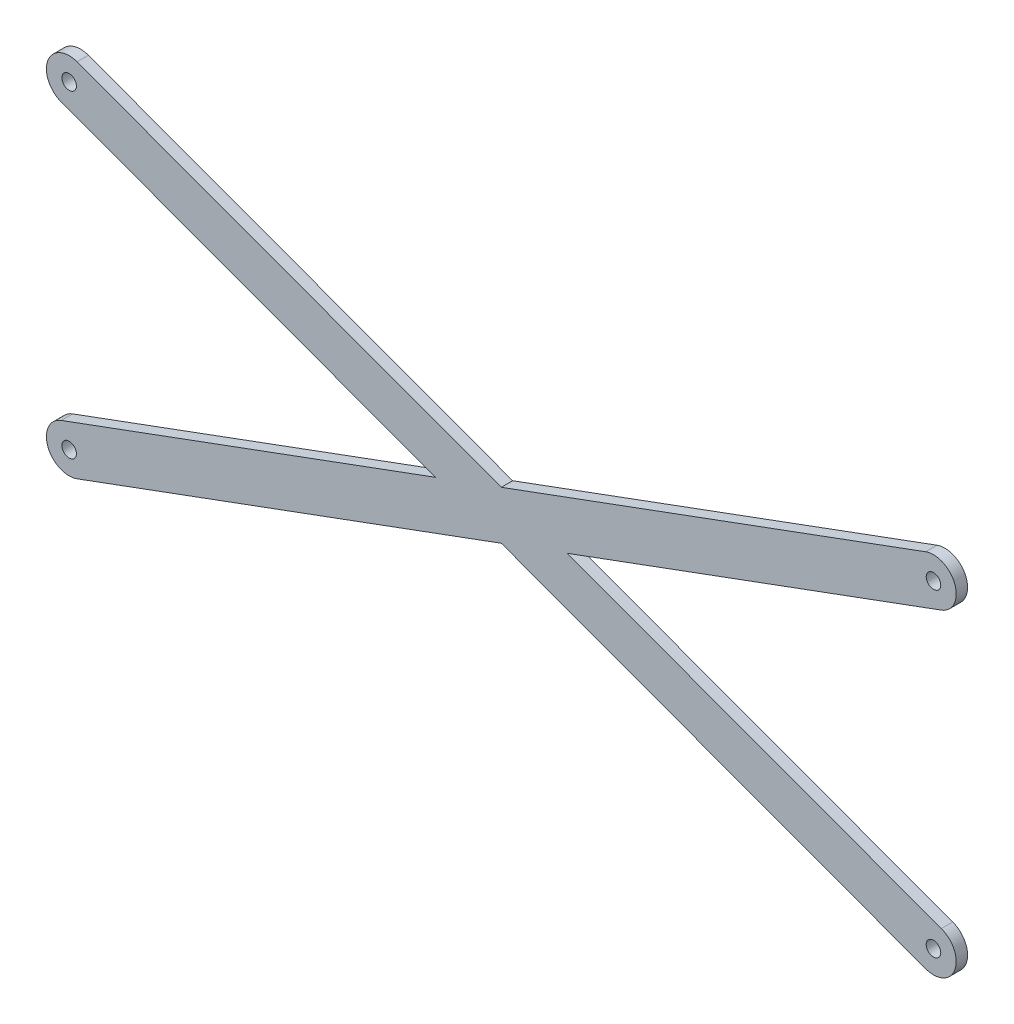
ISO-10303-21;
HEADER;
FILE_DESCRIPTION(('STEP AP214'),'2;1');
FILE_NAME('part.step','',(''),(''),'','','');
FILE_SCHEMA(('AUTOMOTIVE_DESIGN { 1 0 10303 214 1 1 1 1 }'));
ENDSEC;
DATA;
#1=APPLICATION_CONTEXT('core data for automotive mechanical design processes');
#2=APPLICATION_PROTOCOL_DEFINITION('international standard','automotive_design',2000,#1);
#3=PRODUCT_CONTEXT('',#1,'mechanical');
#4=PRODUCT('Part','Part','',(#3));
#5=PRODUCT_RELATED_PRODUCT_CATEGORY('part','',(#4));
#6=PRODUCT_DEFINITION_FORMATION('','',#4);
#7=PRODUCT_DEFINITION_CONTEXT('part definition',#1,'design');
#8=PRODUCT_DEFINITION('design','',#6,#7);
#9=PRODUCT_DEFINITION_SHAPE('','',#8);
#10=(LENGTH_UNIT() NAMED_UNIT(*) SI_UNIT(.MILLI.,.METRE.));
#11=(NAMED_UNIT(*) PLANE_ANGLE_UNIT() SI_UNIT($,.RADIAN.));
#12=(NAMED_UNIT(*) SI_UNIT($,.STERADIAN.) SOLID_ANGLE_UNIT());
#13=UNCERTAINTY_MEASURE_WITH_UNIT(LENGTH_MEASURE(1.E-05),#10,'distance_accuracy_value','');
#14=(GEOMETRIC_REPRESENTATION_CONTEXT(3) GLOBAL_UNCERTAINTY_ASSIGNED_CONTEXT((#13)) GLOBAL_UNIT_ASSIGNED_CONTEXT((#10,
#11,#12)) REPRESENTATION_CONTEXT('',''));
#15=CARTESIAN_POINT('',(0.,0.,0.));
#16=DIRECTION('',(0.,0.,1.));
#17=DIRECTION('',(1.,0.,0.));
#18=AXIS2_PLACEMENT_3D('',#15,#16,#17);
#19=CARTESIAN_POINT('',(0.,-88.9,3.175));
#20=DIRECTION('',(0.,0.,-1.));
#21=DIRECTION('',(-1.,0.,0.));
#22=AXIS2_PLACEMENT_3D('',#19,#20,#21);
#23=CYLINDRICAL_SURFACE('',#22,6.35000000224302);
#24=CARTESIAN_POINT('',(0.,-88.9,0.));
#25=DIRECTION('',(0.,0.,1.));
#26=DIRECTION('',(1.,0.,0.));
#27=AXIS2_PLACEMENT_3D('',#24,#25,#26);
#28=CIRCLE('',#27,6.35000000224302);
#29=CARTESIAN_POINT('',(-2.19522676691837,-82.9415203701969,0.));
#30=VERTEX_POINT('',#29);
#31=CARTESIAN_POINT('',(2.19545073608075,-94.8583971053835,0.));
#32=VERTEX_POINT('',#31);
#33=EDGE_CURVE('E182',#30,#32,#28,.T.);
#34=ORIENTED_EDGE('',*,*,#33,.T.);
#35=DIRECTION('',(0.,0.,-1.));
#36=VECTOR('',#35,1.);
#37=CARTESIAN_POINT('',(2.19545073608075,-94.8583971053835,3.175));
#38=LINE('',#37,#36);
#39=CARTESIAN_POINT('',(2.19545073608075,-94.8583971053835,3.175));
#40=VERTEX_POINT('',#39);
#41=EDGE_CURVE('E11',#40,#32,#38,.T.);
#42=ORIENTED_EDGE('',*,*,#41,.F.);
#43=CARTESIAN_POINT('',(0.,-88.9,3.175));
#44=DIRECTION('',(0.,0.,1.));
#45=DIRECTION('',(1.,0.,0.));
#46=AXIS2_PLACEMENT_3D('',#43,#44,#45);
#47=CIRCLE('',#46,6.35000000224302);
#48=CARTESIAN_POINT('',(-2.19522676691837,-82.9415203701969,3.175));
#49=VERTEX_POINT('',#48);
#50=EDGE_CURVE('E217',#49,#40,#47,.T.);
#51=ORIENTED_EDGE('',*,*,#50,.F.);
#52=DIRECTION('',(0.,0.,-1.));
#53=VECTOR('',#52,1.);
#54=CARTESIAN_POINT('',(-2.19522676691837,-82.9415203701969,3.175));
#55=LINE('',#54,#53);
#56=EDGE_CURVE('E178',#49,#30,#55,.T.);
#57=ORIENTED_EDGE('',*,*,#56,.T.);
#58=EDGE_LOOP('',(#34,#42,#51,#57));
#59=FACE_BOUND('',#58,.T.);
#60=ADVANCED_FACE('F49',(#59),#23,.T.);
#61=CARTESIAN_POINT('',(2.19545073608075,-94.8583971053835,3.175));
#62=DIRECTION('',(-0.345705002420081,0.938343248124977,0.));
#63=DIRECTION('',(-0.938343248124977,-0.345705002420081,0.));
#64=AXIS2_PLACEMENT_3D('',#61,#62,#63);
#65=PLANE('',#64);
#66=DIRECTION('',(0.938343248124977,0.345705002420081,0.));
#67=VECTOR('',#66,1.);
#68=CARTESIAN_POINT('',(2.19545073608075,-94.8583971053835,0.));
#69=LINE('',#68,#67);
#70=CARTESIAN_POINT('',(120.65,-51.2172984756647,0.));
#71=VERTEX_POINT('',#70);
#72=EDGE_CURVE('E186',#32,#71,#69,.T.);
#73=ORIENTED_EDGE('',*,*,#72,.T.);
#74=DIRECTION('',(0.,0.,-1.));
#75=VECTOR('',#74,1.);
#76=CARTESIAN_POINT('',(120.65,-51.2172984756647,3.175));
#77=LINE('',#76,#75);
#78=CARTESIAN_POINT('',(120.65,-51.2172984756647,3.175));
#79=VERTEX_POINT('',#78);
#80=EDGE_CURVE('E58',#79,#71,#77,.T.);
#81=ORIENTED_EDGE('',*,*,#80,.F.);
#82=DIRECTION('',(0.938343248124977,0.345705002420081,0.));
#83=VECTOR('',#82,1.);
#84=CARTESIAN_POINT('',(2.19545073608075,-94.8583971053835,3.175));
#85=LINE('',#84,#83);
#86=EDGE_CURVE('E128',#40,#79,#85,.T.);
#87=ORIENTED_EDGE('',*,*,#86,.F.);
#88=ORIENTED_EDGE('',*,*,#41,.T.);
#89=EDGE_LOOP('',(#73,#81,#87,#88));
#90=FACE_BOUND('',#89,.T.);
#91=ADVANCED_FACE('F313',(#90),#65,.F.);
#92=CARTESIAN_POINT('',(120.65,-51.2172984756647,3.175));
#93=DIRECTION('',(0.34570570242205,0.93834299022952,0.));
#94=DIRECTION('',(-0.93834299022952,0.34570570242205,0.));
#95=AXIS2_PLACEMENT_3D('',#92,#93,#94);
#96=PLANE('',#95);
#97=DIRECTION('',(0.93834299022952,-0.34570570242205,0.));
#98=VECTOR('',#97,1.);
#99=CARTESIAN_POINT('',(120.65,-51.2172984756647,0.));
#100=LINE('',#99,#98);
#101=CARTESIAN_POINT('',(239.104516707713,-94.8584854722301,0.));
#102=VERTEX_POINT('',#101);
#103=EDGE_CURVE('E190',#71,#102,#100,.T.);
#104=ORIENTED_EDGE('',*,*,#103,.T.);
#105=DIRECTION('',(0.,0.,-1.));
#106=VECTOR('',#105,1.);
#107=CARTESIAN_POINT('',(239.104516707713,-94.8584854722301,3.175));
#108=LINE('',#107,#106);
#109=CARTESIAN_POINT('',(239.104516707713,-94.8584854722301,3.175));
#110=VERTEX_POINT('',#109);
#111=EDGE_CURVE('E244',#110,#102,#108,.T.);
#112=ORIENTED_EDGE('',*,*,#111,.F.);
#113=DIRECTION('',(0.93834299022952,-0.34570570242205,0.));
#114=VECTOR('',#113,1.);
#115=CARTESIAN_POINT('',(120.65,-51.2172984756647,3.175));
#116=LINE('',#115,#114);
#117=EDGE_CURVE('E254',#79,#110,#116,.T.);
#118=ORIENTED_EDGE('',*,*,#117,.F.);
#119=ORIENTED_EDGE('',*,*,#80,.T.);
#120=EDGE_LOOP('',(#104,#112,#118,#119));
#121=FACE_BOUND('',#120,.T.);
#122=ADVANCED_FACE('F252',(#121),#96,.F.);
#123=CARTESIAN_POINT('',(241.299727603608,-88.9,3.175));
#124=DIRECTION('',(0.,0.,-1.));
#125=DIRECTION('',(-1.,0.,0.));
#126=AXIS2_PLACEMENT_3D('',#123,#124,#125);
#127=CYLINDRICAL_SURFACE('',#126,6.35000000001843);
#128=CARTESIAN_POINT('',(241.299727603608,-88.9,0.));
#129=DIRECTION('',(0.,0.,1.));
#130=DIRECTION('',(1.,0.,0.));
#131=AXIS2_PLACEMENT_3D('',#128,#129,#130);
#132=CIRCLE('',#131,6.35000000001843);
#133=CARTESIAN_POINT('',(243.494958814001,-82.9415220120079,0.));
#134=VERTEX_POINT('',#133);
#135=EDGE_CURVE('E193',#102,#134,#132,.T.);
#136=ORIENTED_EDGE('',*,*,#135,.T.);
#137=DIRECTION('',(0.,0.,-1.));
#138=VECTOR('',#137,1.);
#139=CARTESIAN_POINT('',(243.494958814001,-82.9415220120079,3.175));
#140=LINE('',#139,#138);
#141=CARTESIAN_POINT('',(243.494958814001,-82.9415220120079,3.175));
#142=VERTEX_POINT('',#141);
#143=EDGE_CURVE('E240',#142,#134,#140,.T.);
#144=ORIENTED_EDGE('',*,*,#143,.F.);
#145=CARTESIAN_POINT('',(241.299727603608,-88.9,3.175));
#146=DIRECTION('',(0.,0.,1.));
#147=DIRECTION('',(1.,0.,0.));
#148=AXIS2_PLACEMENT_3D('',#145,#146,#147);
#149=CIRCLE('',#148,6.35000000001843);
#150=EDGE_CURVE('E273',#110,#142,#149,.T.);
#151=ORIENTED_EDGE('',*,*,#150,.F.);
#152=ORIENTED_EDGE('',*,*,#111,.T.);
#153=EDGE_LOOP('',(#136,#144,#151,#152));
#154=FACE_BOUND('',#153,.T.);
#155=ADVANCED_FACE('F263',(#154),#127,.T.);
#156=CARTESIAN_POINT('',(139.018245756537,-44.4500579627661,3.175));
#157=DIRECTION('',(-0.34570570242205,-0.93834299022952,0.));
#158=DIRECTION('',(0.93834299022952,-0.34570570242205,0.));
#159=AXIS2_PLACEMENT_3D('',#156,#157,#158);
#160=PLANE('',#159);
#161=DIRECTION('',(-0.93834299022952,0.34570570242205,0.));
#162=VECTOR('',#161,1.);
#163=CARTESIAN_POINT('',(139.018245756537,-44.4500579627661,0.));
#164=LINE('',#163,#162);
#165=CARTESIAN_POINT('',(139.018245756537,-44.4500579627661,0.));
#166=VERTEX_POINT('',#165);
#167=EDGE_CURVE('E196',#134,#166,#164,.T.);
#168=ORIENTED_EDGE('',*,*,#167,.T.);
#169=DIRECTION('',(0.,0.,-1.));
#170=VECTOR('',#169,1.);
#171=CARTESIAN_POINT('',(139.018245756537,-44.4500579627661,3.175));
#172=LINE('',#171,#170);
#173=CARTESIAN_POINT('',(139.018245756537,-44.4500579627661,3.175));
#174=VERTEX_POINT('',#173);
#175=EDGE_CURVE('E236',#174,#166,#172,.T.);
#176=ORIENTED_EDGE('',*,*,#175,.F.);
#177=DIRECTION('',(-0.93834299022952,0.34570570242205,0.));
#178=VECTOR('',#177,1.);
#179=CARTESIAN_POINT('',(139.018245756537,-44.4500579627661,3.175));
#180=LINE('',#179,#178);
#181=EDGE_CURVE('E269',#142,#174,#180,.T.);
#182=ORIENTED_EDGE('',*,*,#181,.F.);
#183=ORIENTED_EDGE('',*,*,#143,.T.);
#184=EDGE_LOOP('',(#168,#176,#182,#183));
#185=FACE_BOUND('',#184,.T.);
#186=ADVANCED_FACE('F267',(#185),#160,.F.);
#187=CARTESIAN_POINT('',(139.018245756537,-44.4500579627661,3.175));
#188=DIRECTION('',(-0.345705002420081,0.938343248124977,0.));
#189=DIRECTION('',(-0.938343248124977,-0.345705002420081,0.));
#190=AXIS2_PLACEMENT_3D('',#187,#188,#189);
#191=PLANE('',#190);
#192=DIRECTION('',(0.938343248124977,0.345705002420081,0.));
#193=VECTOR('',#192,1.);
#194=CARTESIAN_POINT('',(139.018245756537,-44.4500579627661,0.));
#195=LINE('',#194,#193);
#196=CARTESIAN_POINT('',(243.495226766108,-5.9585837105964,0.));
#197=VERTEX_POINT('',#196);
#198=EDGE_CURVE('E199',#166,#197,#195,.T.);
#199=ORIENTED_EDGE('',*,*,#198,.T.);
#200=DIRECTION('',(0.,0.,-1.));
#201=VECTOR('',#200,1.);
#202=CARTESIAN_POINT('',(243.495226766108,-5.9585837105964,3.175));
#203=LINE('',#202,#201);
#204=CARTESIAN_POINT('',(243.495226766108,-5.9585837105964,3.175));
#205=VERTEX_POINT('',#204);
#206=EDGE_CURVE('E232',#205,#197,#203,.T.);
#207=ORIENTED_EDGE('',*,*,#206,.F.);
#208=DIRECTION('',(0.938343248124977,0.345705002420081,0.));
#209=VECTOR('',#208,1.);
#210=CARTESIAN_POINT('',(139.018245756537,-44.4500579627661,3.175));
#211=LINE('',#210,#209);
#212=EDGE_CURVE('E272',#174,#205,#211,.T.);
#213=ORIENTED_EDGE('',*,*,#212,.F.);
#214=ORIENTED_EDGE('',*,*,#175,.T.);
#215=EDGE_LOOP('',(#199,#207,#213,#214));
#216=FACE_BOUND('',#215,.T.);
#217=ADVANCED_FACE('F326',(#216),#191,.F.);
#218=CARTESIAN_POINT('',(241.3,-0.000104082991909853,3.175));
#219=DIRECTION('',(0.,0.,-1.));
#220=DIRECTION('',(-1.,0.,0.));
#221=AXIS2_PLACEMENT_3D('',#218,#219,#220);
#222=CYLINDRICAL_SURFACE('',#221,6.35000000214303);
#223=CARTESIAN_POINT('',(241.3,-0.000104082991909853,0.));
#224=DIRECTION('',(0.,0.,1.));
#225=DIRECTION('',(1.,0.,0.));
#226=AXIS2_PLACEMENT_3D('',#223,#224,#225);
#227=CIRCLE('',#226,6.35000000214303);
#228=CARTESIAN_POINT('',(239.104554312271,5.95829488252167,0.));
#229=VERTEX_POINT('',#228);
#230=EDGE_CURVE('E202',#197,#229,#227,.T.);
#231=ORIENTED_EDGE('',*,*,#230,.T.);
#232=DIRECTION('',(0.,0.,-1.));
#233=VECTOR('',#232,1.);
#234=CARTESIAN_POINT('',(239.104554312271,5.95829488252167,3.175));
#235=LINE('',#234,#233);
#236=CARTESIAN_POINT('',(239.104554312271,5.95829488252167,3.175));
#237=VERTEX_POINT('',#236);
#238=EDGE_CURVE('E228',#237,#229,#235,.T.);
#239=ORIENTED_EDGE('',*,*,#238,.F.);
#240=CARTESIAN_POINT('',(241.3,-0.000104082991909853,3.175));
#241=DIRECTION('',(0.,0.,1.));
#242=DIRECTION('',(1.,0.,0.));
#243=AXIS2_PLACEMENT_3D('',#240,#241,#242);
#244=CIRCLE('',#243,6.35000000214303);
#245=EDGE_CURVE('E277',#205,#237,#244,.T.);
#246=ORIENTED_EDGE('',*,*,#245,.F.);
#247=ORIENTED_EDGE('',*,*,#206,.T.);
#248=EDGE_LOOP('',(#231,#239,#246,#247));
#249=FACE_BOUND('',#248,.T.);
#250=ADVANCED_FACE('F329',(#249),#222,.T.);
#251=CARTESIAN_POINT('',(120.650005048352,-37.6828037471971,3.175));
#252=DIRECTION('',(0.345705002420081,-0.938343248124977,0.));
#253=DIRECTION('',(0.938343248124977,0.345705002420081,0.));
#254=AXIS2_PLACEMENT_3D('',#251,#252,#253);
#255=PLANE('',#254);
#256=DIRECTION('',(-0.938343248124977,-0.345705002420081,0.));
#257=VECTOR('',#256,1.);
#258=CARTESIAN_POINT('',(120.650005048352,-37.6828037471971,0.));
#259=LINE('',#258,#257);
#260=CARTESIAN_POINT('',(120.650005048352,-37.6828037471971,0.));
#261=VERTEX_POINT('',#260);
#262=EDGE_CURVE('E205',#229,#261,#259,.T.);
#263=ORIENTED_EDGE('',*,*,#262,.T.);
#264=DIRECTION('',(0.,0.,-1.));
#265=VECTOR('',#264,1.);
#266=CARTESIAN_POINT('',(120.650005048352,-37.6828037471971,3.175));
#267=LINE('',#266,#265);
#268=CARTESIAN_POINT('',(120.650005048352,-37.6828037471971,3.175));
#269=VERTEX_POINT('',#268);
#270=EDGE_CURVE('E224',#269,#261,#267,.T.);
#271=ORIENTED_EDGE('',*,*,#270,.F.);
#272=DIRECTION('',(-0.938343248124977,-0.345705002420081,0.));
#273=VECTOR('',#272,1.);
#274=CARTESIAN_POINT('',(120.650005048352,-37.6828037471971,3.175));
#275=LINE('',#274,#273);
#276=EDGE_CURVE('E284',#237,#269,#275,.T.);
#277=ORIENTED_EDGE('',*,*,#276,.F.);
#278=ORIENTED_EDGE('',*,*,#238,.T.);
#279=EDGE_LOOP('',(#263,#271,#277,#278));
#280=FACE_BOUND('',#279,.T.);
#281=ADVANCED_FACE('F292',(#280),#255,.F.);
#282=CARTESIAN_POINT('',(2.1954883406325,5.95838324935099,3.175));
#283=DIRECTION('',(-0.34570570242205,-0.93834299022952,0.));
#284=DIRECTION('',(0.93834299022952,-0.34570570242205,0.));
#285=AXIS2_PLACEMENT_3D('',#282,#283,#284);
#286=PLANE('',#285);
#287=DIRECTION('',(-0.93834299022952,0.34570570242205,0.));
#288=VECTOR('',#287,1.);
#289=CARTESIAN_POINT('',(2.1954883406325,5.95838324935099,0.));
#290=LINE('',#289,#288);
#291=CARTESIAN_POINT('',(2.19548834165465,5.95838325212504,0.));
#292=VERTEX_POINT('',#291);
#293=EDGE_CURVE('E208',#261,#292,#290,.T.);
#294=ORIENTED_EDGE('',*,*,#293,.T.);
#295=DIRECTION('',(0.,0.,-1.));
#296=VECTOR('',#295,1.);
#297=CARTESIAN_POINT('',(2.19548834165465,5.95838325212504,3.175));
#298=LINE('',#297,#296);
#299=CARTESIAN_POINT('',(2.19548834165465,5.95838325212504,3.175));
#300=VERTEX_POINT('',#299);
#301=EDGE_CURVE('E171',#300,#292,#298,.T.);
#302=ORIENTED_EDGE('',*,*,#301,.F.);
#303=DIRECTION('',(-0.93834299022952,0.34570570242205,0.));
#304=VECTOR('',#303,1.);
#305=CARTESIAN_POINT('',(2.1954883406325,5.95838324935099,3.175));
#306=LINE('',#305,#304);
#307=EDGE_CURVE('E160',#269,#300,#306,.T.);
#308=ORIENTED_EDGE('',*,*,#307,.F.);
#309=ORIENTED_EDGE('',*,*,#270,.T.);
#310=EDGE_LOOP('',(#294,#302,#308,#309));
#311=FACE_BOUND('',#310,.T.);
#312=ADVANCED_FACE('F296',(#311),#286,.F.);
#313=CARTESIAN_POINT('',(0.,0.,3.175));
#314=DIRECTION('',(0.,0.,-1.));
#315=DIRECTION('',(-1.,0.,0.));
#316=AXIS2_PLACEMENT_3D('',#313,#314,#315);
#317=CYLINDRICAL_SURFACE('',#316,6.35000000295635);
#318=CARTESIAN_POINT('',(0.,0.,0.));
#319=DIRECTION('',(0.,0.,1.));
#320=DIRECTION('',(1.,0.,0.));
#321=AXIS2_PLACEMENT_3D('',#318,#319,#320);
#322=CIRCLE('',#321,6.35000000295635);
#323=CARTESIAN_POINT('',(-2.19523121242408,-5.95847799350562,0.));
#324=VERTEX_POINT('',#323);
#325=EDGE_CURVE('E169',#292,#324,#322,.T.);
#326=ORIENTED_EDGE('',*,*,#325,.T.);
#327=DIRECTION('',(0.,0.,-1.));
#328=VECTOR('',#327,1.);
#329=CARTESIAN_POINT('',(-2.19523121242408,-5.95847799350562,3.175));
#330=LINE('',#329,#328);
#331=CARTESIAN_POINT('',(-2.19523121242408,-5.95847799350562,3.175));
#332=VERTEX_POINT('',#331);
#333=EDGE_CURVE('E166',#332,#324,#330,.T.);
#334=ORIENTED_EDGE('',*,*,#333,.F.);
#335=CARTESIAN_POINT('',(0.,0.,3.175));
#336=DIRECTION('',(0.,0.,1.));
#337=DIRECTION('',(1.,0.,0.));
#338=AXIS2_PLACEMENT_3D('',#335,#336,#337);
#339=CIRCLE('',#338,6.35000000295635);
#340=EDGE_CURVE('E154',#300,#332,#339,.T.);
#341=ORIENTED_EDGE('',*,*,#340,.F.);
#342=ORIENTED_EDGE('',*,*,#301,.T.);
#343=EDGE_LOOP('',(#326,#334,#341,#342));
#344=FACE_BOUND('',#343,.T.);
#345=ADVANCED_FACE('F167',(#344),#317,.T.);
#346=CARTESIAN_POINT('',(-2.19523121242408,-5.95847799350562,3.175));
#347=DIRECTION('',(0.34570570242205,0.93834299022952,0.));
#348=DIRECTION('',(-0.93834299022952,0.34570570242205,0.));
#349=AXIS2_PLACEMENT_3D('',#346,#347,#348);
#350=PLANE('',#349);
#351=DIRECTION('',(0.93834299022952,-0.34570570242205,0.));
#352=VECTOR('',#351,1.);
#353=CARTESIAN_POINT('',(-2.19523121242408,-5.95847799350562,0.));
#354=LINE('',#353,#352);
#355=CARTESIAN_POINT('',(102.281759291815,-44.4500442600957,0.));
#356=VERTEX_POINT('',#355);
#357=EDGE_CURVE('E112',#324,#356,#354,.T.);
#358=ORIENTED_EDGE('',*,*,#357,.T.);
#359=DIRECTION('',(0.,0.,-1.));
#360=VECTOR('',#359,1.);
#361=CARTESIAN_POINT('',(102.281759291815,-44.4500442600957,3.175));
#362=LINE('',#361,#360);
#363=CARTESIAN_POINT('',(102.281759291815,-44.4500442600957,3.175));
#364=VERTEX_POINT('',#363);
#365=EDGE_CURVE('E172',#364,#356,#362,.T.);
#366=ORIENTED_EDGE('',*,*,#365,.F.);
#367=DIRECTION('',(0.93834299022952,-0.34570570242205,0.));
#368=VECTOR('',#367,1.);
#369=CARTESIAN_POINT('',(-2.19523121242408,-5.95847799350562,3.175));
#370=LINE('',#369,#368);
#371=EDGE_CURVE('E158',#332,#364,#370,.T.);
#372=ORIENTED_EDGE('',*,*,#371,.F.);
#373=ORIENTED_EDGE('',*,*,#333,.T.);
#374=EDGE_LOOP('',(#358,#366,#372,#373));
#375=FACE_BOUND('',#374,.T.);
#376=ADVANCED_FACE('F174',(#375),#350,.F.);
#377=CARTESIAN_POINT('',(-2.19522676691837,-82.9415203701969,3.175));
#378=DIRECTION('',(0.345705002420081,-0.938343248124977,0.));
#379=DIRECTION('',(0.938343248124977,0.345705002420081,0.));
#380=AXIS2_PLACEMENT_3D('',#377,#378,#379);
#381=PLANE('',#380);
#382=DIRECTION('',(-0.938343248124977,-0.345705002420081,0.));
#383=VECTOR('',#382,1.);
#384=CARTESIAN_POINT('',(-2.19522676691837,-82.9415203701969,0.));
#385=LINE('',#384,#383);
#386=EDGE_CURVE('E119',#356,#30,#385,.T.);
#387=ORIENTED_EDGE('',*,*,#386,.T.);
#388=ORIENTED_EDGE('',*,*,#56,.F.);
#389=DIRECTION('',(-0.938343248124977,-0.345705002420081,0.));
#390=VECTOR('',#389,1.);
#391=CARTESIAN_POINT('',(-2.19522676691837,-82.9415203701969,3.175));
#392=LINE('',#391,#390);
#393=EDGE_CURVE('E69',#364,#49,#392,.T.);
#394=ORIENTED_EDGE('',*,*,#393,.F.);
#395=ORIENTED_EDGE('',*,*,#365,.T.);
#396=EDGE_LOOP('',(#387,#388,#394,#395));
#397=FACE_BOUND('',#396,.T.);
#398=ADVANCED_FACE('F300',(#397),#381,.F.);
#399=CARTESIAN_POINT('',(0.,-88.9,3.175));
#400=DIRECTION('',(0.,0.,1.));
#401=DIRECTION('',(1.,0.,0.));
#402=AXIS2_PLACEMENT_3D('',#399,#400,#401);
#403=PLANE('',#402);
#404=CARTESIAN_POINT('',(241.3,-0.000104082991909853,3.175));
#405=DIRECTION('',(0.,0.,1.));
#406=DIRECTION('',(1.,0.,0.));
#407=AXIS2_PLACEMENT_3D('',#404,#405,#406);
#408=CIRCLE('',#407,2.03200000000001);
#409=CARTESIAN_POINT('',(243.332,-0.000104082991909853,3.175));
#410=VERTEX_POINT('',#409);
#411=EDGE_CURVE('E440',#410,#410,#408,.T.);
#412=ORIENTED_EDGE('',*,*,#411,.F.);
#413=EDGE_LOOP('',(#412));
#414=FACE_BOUND('',#413,.T.);
#415=CARTESIAN_POINT('',(241.299727603608,-88.9,3.175));
#416=DIRECTION('',(0.,0.,1.));
#417=DIRECTION('',(1.,0.,0.));
#418=AXIS2_PLACEMENT_3D('',#415,#416,#417);
#419=CIRCLE('',#418,2.03200000000001);
#420=CARTESIAN_POINT('',(243.331727603608,-88.9,3.175));
#421=VERTEX_POINT('',#420);
#422=EDGE_CURVE('E447',#421,#421,#419,.T.);
#423=ORIENTED_EDGE('',*,*,#422,.F.);
#424=EDGE_LOOP('',(#423));
#425=FACE_BOUND('',#424,.T.);
#426=CARTESIAN_POINT('',(0.,-88.9,3.175));
#427=DIRECTION('',(0.,0.,1.));
#428=DIRECTION('',(1.,0.,0.));
#429=AXIS2_PLACEMENT_3D('',#426,#427,#428);
#430=CIRCLE('',#429,2.032);
#431=CARTESIAN_POINT('',(2.032,-88.9,3.175));
#432=VERTEX_POINT('',#431);
#433=EDGE_CURVE('E459',#432,#432,#430,.T.);
#434=ORIENTED_EDGE('',*,*,#433,.F.);
#435=EDGE_LOOP('',(#434));
#436=FACE_BOUND('',#435,.T.);
#437=CARTESIAN_POINT('',(0.,0.,3.175));
#438=DIRECTION('',(0.,0.,1.));
#439=DIRECTION('',(1.,0.,0.));
#440=AXIS2_PLACEMENT_3D('',#437,#438,#439);
#441=CIRCLE('',#440,2.032);
#442=CARTESIAN_POINT('',(2.032,0.,3.175));
#443=VERTEX_POINT('',#442);
#444=EDGE_CURVE('E455',#443,#443,#441,.T.);
#445=ORIENTED_EDGE('',*,*,#444,.F.);
#446=EDGE_LOOP('',(#445));
#447=FACE_BOUND('',#446,.T.);
#448=ORIENTED_EDGE('',*,*,#50,.T.);
#449=ORIENTED_EDGE('',*,*,#86,.T.);
#450=ORIENTED_EDGE('',*,*,#117,.T.);
#451=ORIENTED_EDGE('',*,*,#150,.T.);
#452=ORIENTED_EDGE('',*,*,#181,.T.);
#453=ORIENTED_EDGE('',*,*,#212,.T.);
#454=ORIENTED_EDGE('',*,*,#245,.T.);
#455=ORIENTED_EDGE('',*,*,#276,.T.);
#456=ORIENTED_EDGE('',*,*,#307,.T.);
#457=ORIENTED_EDGE('',*,*,#340,.T.);
#458=ORIENTED_EDGE('',*,*,#371,.T.);
#459=ORIENTED_EDGE('',*,*,#393,.T.);
#460=EDGE_LOOP('',(#448,#449,#450,#451,#452,#453,#454,#455,#456,#457,#458,#459));
#461=FACE_BOUND('',#460,.T.);
#462=ADVANCED_FACE('F156',(#414,#425,#436,#447,#461),#403,.T.);
#463=CARTESIAN_POINT('',(0.,-88.9,0.));
#464=DIRECTION('',(0.,0.,1.));
#465=DIRECTION('',(1.,0.,0.));
#466=AXIS2_PLACEMENT_3D('',#463,#464,#465);
#467=PLANE('',#466);
#468=CARTESIAN_POINT('',(241.3,-0.000104082991909853,0.));
#469=DIRECTION('',(0.,0.,1.));
#470=DIRECTION('',(1.,0.,0.));
#471=AXIS2_PLACEMENT_3D('',#468,#469,#470);
#472=CIRCLE('',#471,2.03200000000001);
#473=CARTESIAN_POINT('',(243.332,-0.000104082991909853,0.));
#474=VERTEX_POINT('',#473);
#475=EDGE_CURVE('E437',#474,#474,#472,.T.);
#476=ORIENTED_EDGE('',*,*,#475,.T.);
#477=EDGE_LOOP('',(#476));
#478=FACE_BOUND('',#477,.T.);
#479=CARTESIAN_POINT('',(241.299727603608,-88.9,0.));
#480=DIRECTION('',(0.,0.,1.));
#481=DIRECTION('',(1.,0.,0.));
#482=AXIS2_PLACEMENT_3D('',#479,#480,#481);
#483=CIRCLE('',#482,2.03200000000001);
#484=CARTESIAN_POINT('',(243.331727603608,-88.9,0.));
#485=VERTEX_POINT('',#484);
#486=EDGE_CURVE('E442',#485,#485,#483,.T.);
#487=ORIENTED_EDGE('',*,*,#486,.T.);
#488=EDGE_LOOP('',(#487));
#489=FACE_BOUND('',#488,.T.);
#490=CARTESIAN_POINT('',(0.,-88.9,0.));
#491=DIRECTION('',(0.,0.,1.));
#492=DIRECTION('',(1.,0.,0.));
#493=AXIS2_PLACEMENT_3D('',#490,#491,#492);
#494=CIRCLE('',#493,2.032);
#495=CARTESIAN_POINT('',(2.032,-88.9,0.));
#496=VERTEX_POINT('',#495);
#497=EDGE_CURVE('E467',#496,#496,#494,.T.);
#498=ORIENTED_EDGE('',*,*,#497,.T.);
#499=EDGE_LOOP('',(#498));
#500=FACE_BOUND('',#499,.T.);
#501=CARTESIAN_POINT('',(0.,0.,0.));
#502=DIRECTION('',(0.,0.,1.));
#503=DIRECTION('',(1.,0.,0.));
#504=AXIS2_PLACEMENT_3D('',#501,#502,#503);
#505=CIRCLE('',#504,2.032);
#506=CARTESIAN_POINT('',(2.032,0.,0.));
#507=VERTEX_POINT('',#506);
#508=EDGE_CURVE('E187',#507,#507,#505,.T.);
#509=ORIENTED_EDGE('',*,*,#508,.T.);
#510=EDGE_LOOP('',(#509));
#511=FACE_BOUND('',#510,.T.);
#512=ORIENTED_EDGE('',*,*,#33,.F.);
#513=ORIENTED_EDGE('',*,*,#386,.F.);
#514=ORIENTED_EDGE('',*,*,#357,.F.);
#515=ORIENTED_EDGE('',*,*,#325,.F.);
#516=ORIENTED_EDGE('',*,*,#293,.F.);
#517=ORIENTED_EDGE('',*,*,#262,.F.);
#518=ORIENTED_EDGE('',*,*,#230,.F.);
#519=ORIENTED_EDGE('',*,*,#198,.F.);
#520=ORIENTED_EDGE('',*,*,#167,.F.);
#521=ORIENTED_EDGE('',*,*,#135,.F.);
#522=ORIENTED_EDGE('',*,*,#103,.F.);
#523=ORIENTED_EDGE('',*,*,#72,.F.);
#524=EDGE_LOOP('',(#512,#513,#514,#515,#516,#517,#518,#519,#520,#521,#522,#523));
#525=FACE_BOUND('',#524,.T.);
#526=ADVANCED_FACE('F258',(#478,#489,#500,#511,#525),#467,.F.);
#527=CARTESIAN_POINT('',(0.,0.,0.));
#528=DIRECTION('',(0.,0.,1.));
#529=DIRECTION('',(1.,0.,0.));
#530=AXIS2_PLACEMENT_3D('',#527,#528,#529);
#531=CYLINDRICAL_SURFACE('',#530,2.032);
#532=ORIENTED_EDGE('',*,*,#508,.F.);
#533=EDGE_LOOP('',(#532));
#534=FACE_BOUND('',#533,.T.);
#535=ORIENTED_EDGE('',*,*,#444,.T.);
#536=EDGE_LOOP('',(#535));
#537=FACE_BOUND('',#536,.T.);
#538=ADVANCED_FACE('F343',(#534,#537),#531,.F.);
#539=CARTESIAN_POINT('',(0.,-88.9,0.));
#540=DIRECTION('',(0.,0.,1.));
#541=DIRECTION('',(1.,0.,0.));
#542=AXIS2_PLACEMENT_3D('',#539,#540,#541);
#543=CYLINDRICAL_SURFACE('',#542,2.032);
#544=ORIENTED_EDGE('',*,*,#497,.F.);
#545=EDGE_LOOP('',(#544));
#546=FACE_BOUND('',#545,.T.);
#547=ORIENTED_EDGE('',*,*,#433,.T.);
#548=EDGE_LOOP('',(#547));
#549=FACE_BOUND('',#548,.T.);
#550=ADVANCED_FACE('F401',(#546,#549),#543,.F.);
#551=CARTESIAN_POINT('',(241.299727603608,-88.9,0.));
#552=DIRECTION('',(0.,0.,1.));
#553=DIRECTION('',(1.,0.,0.));
#554=AXIS2_PLACEMENT_3D('',#551,#552,#553);
#555=CYLINDRICAL_SURFACE('',#554,2.03200000000001);
#556=ORIENTED_EDGE('',*,*,#486,.F.);
#557=EDGE_LOOP('',(#556));
#558=FACE_BOUND('',#557,.T.);
#559=ORIENTED_EDGE('',*,*,#422,.T.);
#560=EDGE_LOOP('',(#559));
#561=FACE_BOUND('',#560,.T.);
#562=ADVANCED_FACE('F411',(#558,#561),#555,.F.);
#563=CARTESIAN_POINT('',(241.3,-0.000104082991909853,0.));
#564=DIRECTION('',(0.,0.,1.));
#565=DIRECTION('',(1.,0.,0.));
#566=AXIS2_PLACEMENT_3D('',#563,#564,#565);
#567=CYLINDRICAL_SURFACE('',#566,2.03200000000001);
#568=ORIENTED_EDGE('',*,*,#475,.F.);
#569=EDGE_LOOP('',(#568));
#570=FACE_BOUND('',#569,.T.);
#571=ORIENTED_EDGE('',*,*,#411,.T.);
#572=EDGE_LOOP('',(#571));
#573=FACE_BOUND('',#572,.T.);
#574=ADVANCED_FACE('F421',(#570,#573),#567,.F.);
#575=CLOSED_SHELL('',(#60,#91,#122,#155,#186,#217,#250,#281,#312,#345,#376,#398,#462,#526,#538,
#550,#562,#574));
#576=MANIFOLD_SOLID_BREP('B2',#575);
#577=ADVANCED_BREP_SHAPE_REPRESENTATION('',(#18,#576),#14);
#578=SHAPE_DEFINITION_REPRESENTATION(#9,#577);
ENDSEC;
END-ISO-10303-21;
